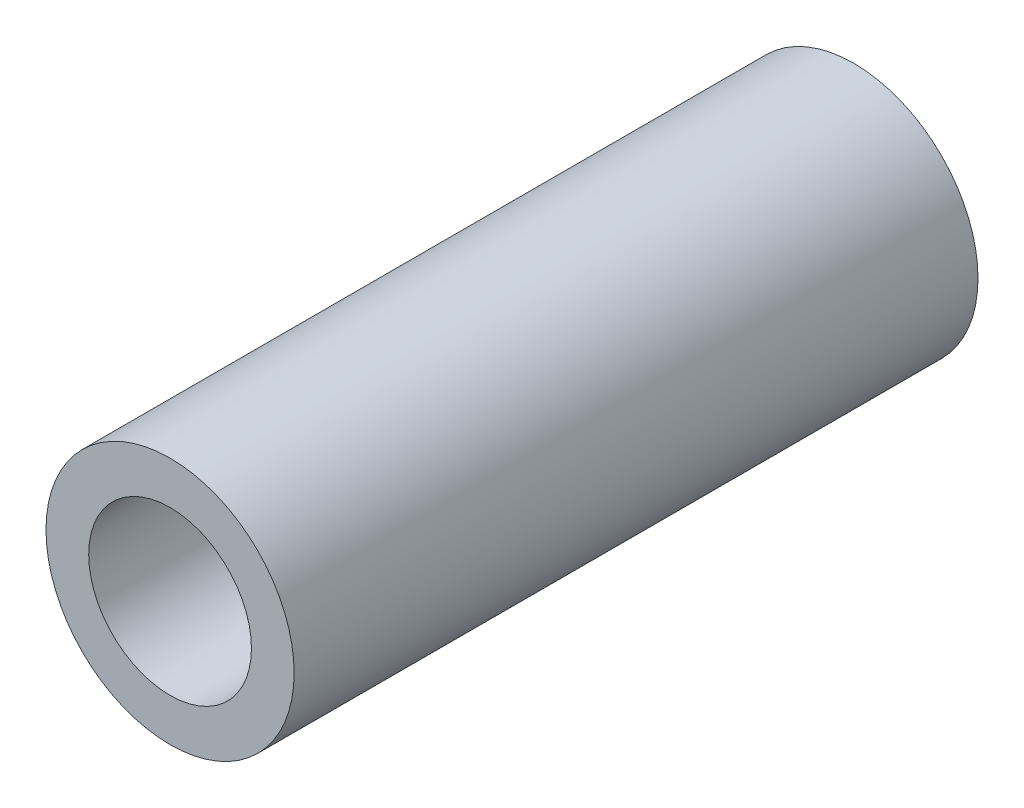
ISO-10303-21;
HEADER;
FILE_DESCRIPTION(('STEP AP214'),'2;1');
FILE_NAME('part.step','',(''),(''),'','','');
FILE_SCHEMA(('AUTOMOTIVE_DESIGN { 1 0 10303 214 1 1 1 1 }'));
ENDSEC;
DATA;
#1=APPLICATION_CONTEXT('core data for automotive mechanical design processes');
#2=APPLICATION_PROTOCOL_DEFINITION('international standard','automotive_design',2000,#1);
#3=PRODUCT_CONTEXT('',#1,'mechanical');
#4=PRODUCT('Part','Part','',(#3));
#5=PRODUCT_RELATED_PRODUCT_CATEGORY('part','',(#4));
#6=PRODUCT_DEFINITION_FORMATION('','',#4);
#7=PRODUCT_DEFINITION_CONTEXT('part definition',#1,'design');
#8=PRODUCT_DEFINITION('design','',#6,#7);
#9=PRODUCT_DEFINITION_SHAPE('','',#8);
#10=(LENGTH_UNIT() NAMED_UNIT(*) SI_UNIT(.MILLI.,.METRE.));
#11=(NAMED_UNIT(*) PLANE_ANGLE_UNIT() SI_UNIT($,.RADIAN.));
#12=(NAMED_UNIT(*) SI_UNIT($,.STERADIAN.) SOLID_ANGLE_UNIT());
#13=UNCERTAINTY_MEASURE_WITH_UNIT(LENGTH_MEASURE(1.E-05),#10,'distance_accuracy_value','');
#14=(GEOMETRIC_REPRESENTATION_CONTEXT(3) GLOBAL_UNCERTAINTY_ASSIGNED_CONTEXT((#13)) GLOBAL_UNIT_ASSIGNED_CONTEXT((#10,
#11,#12)) REPRESENTATION_CONTEXT('',''));
#15=CARTESIAN_POINT('',(0.,0.,0.));
#16=DIRECTION('',(0.,0.,1.));
#17=DIRECTION('',(1.,0.,0.));
#18=AXIS2_PLACEMENT_3D('',#15,#16,#17);
#19=CARTESIAN_POINT('',(0.,0.,35.));
#20=DIRECTION('',(0.,0.,1.));
#21=DIRECTION('',(1.,0.,0.));
#22=AXIS2_PLACEMENT_3D('',#19,#20,#21);
#23=PLANE('',#22);
#24=CARTESIAN_POINT('',(0.,0.,35.));
#25=DIRECTION('',(0.,0.,1.));
#26=DIRECTION('',(1.,0.,0.));
#27=AXIS2_PLACEMENT_3D('',#24,#25,#26);
#28=CIRCLE('',#27,6.35);
#29=CARTESIAN_POINT('',(6.35,0.,35.));
#30=VERTEX_POINT('',#29);
#31=EDGE_CURVE('E10',#30,#30,#28,.T.);
#32=ORIENTED_EDGE('',*,*,#31,.T.);
#33=EDGE_LOOP('',(#32));
#34=FACE_BOUND('',#33,.T.);
#35=CARTESIAN_POINT('',(0.,0.,35.));
#36=DIRECTION('',(0.,0.,1.));
#37=DIRECTION('',(1.,0.,0.));
#38=AXIS2_PLACEMENT_3D('',#35,#36,#37);
#39=CIRCLE('',#38,4.165);
#40=CARTESIAN_POINT('',(4.165,0.,35.));
#41=VERTEX_POINT('',#40);
#42=EDGE_CURVE('E50',#41,#41,#39,.T.);
#43=ORIENTED_EDGE('',*,*,#42,.F.);
#44=EDGE_LOOP('',(#43));
#45=FACE_BOUND('',#44,.T.);
#46=ADVANCED_FACE('F36',(#34,#45),#23,.T.);
#47=CARTESIAN_POINT('',(0.,0.,0.));
#48=DIRECTION('',(0.,0.,1.));
#49=DIRECTION('',(1.,0.,0.));
#50=AXIS2_PLACEMENT_3D('',#47,#48,#49);
#51=PLANE('',#50);
#52=CARTESIAN_POINT('',(0.,0.,0.));
#53=DIRECTION('',(0.,0.,1.));
#54=DIRECTION('',(1.,0.,0.));
#55=AXIS2_PLACEMENT_3D('',#52,#53,#54);
#56=CIRCLE('',#55,6.35);
#57=CARTESIAN_POINT('',(6.35,0.,0.));
#58=VERTEX_POINT('',#57);
#59=EDGE_CURVE('E40',#58,#58,#56,.T.);
#60=ORIENTED_EDGE('',*,*,#59,.F.);
#61=EDGE_LOOP('',(#60));
#62=FACE_BOUND('',#61,.T.);
#63=CARTESIAN_POINT('',(0.,0.,0.));
#64=DIRECTION('',(0.,0.,1.));
#65=DIRECTION('',(1.,0.,0.));
#66=AXIS2_PLACEMENT_3D('',#63,#64,#65);
#67=CIRCLE('',#66,4.165);
#68=CARTESIAN_POINT('',(4.165,0.,0.));
#69=VERTEX_POINT('',#68);
#70=EDGE_CURVE('E52',#69,#69,#67,.T.);
#71=ORIENTED_EDGE('',*,*,#70,.T.);
#72=EDGE_LOOP('',(#71));
#73=FACE_BOUND('',#72,.T.);
#74=ADVANCED_FACE('F63',(#62,#73),#51,.F.);
#75=CARTESIAN_POINT('',(0.,0.,35.));
#76=DIRECTION('',(0.,0.,-1.));
#77=DIRECTION('',(-1.,0.,0.));
#78=AXIS2_PLACEMENT_3D('',#75,#76,#77);
#79=CYLINDRICAL_SURFACE('',#78,6.35);
#80=ORIENTED_EDGE('',*,*,#31,.F.);
#81=EDGE_LOOP('',(#80));
#82=FACE_BOUND('',#81,.T.);
#83=ORIENTED_EDGE('',*,*,#59,.T.);
#84=EDGE_LOOP('',(#83));
#85=FACE_BOUND('',#84,.T.);
#86=ADVANCED_FACE('F38',(#82,#85),#79,.T.);
#87=CARTESIAN_POINT('',(0.,0.,35.));
#88=DIRECTION('',(0.,0.,-1.));
#89=DIRECTION('',(-1.,0.,0.));
#90=AXIS2_PLACEMENT_3D('',#87,#88,#89);
#91=CYLINDRICAL_SURFACE('',#90,4.165);
#92=ORIENTED_EDGE('',*,*,#42,.T.);
#93=EDGE_LOOP('',(#92));
#94=FACE_BOUND('',#93,.T.);
#95=ORIENTED_EDGE('',*,*,#70,.F.);
#96=EDGE_LOOP('',(#95));
#97=FACE_BOUND('',#96,.T.);
#98=ADVANCED_FACE('F59',(#94,#97),#91,.F.);
#99=CLOSED_SHELL('',(#46,#74,#86,#98));
#100=MANIFOLD_SOLID_BREP('B2',#99);
#101=ADVANCED_BREP_SHAPE_REPRESENTATION('',(#18,#100),#14);
#102=SHAPE_DEFINITION_REPRESENTATION(#9,#101);
ENDSEC;
END-ISO-10303-21;
